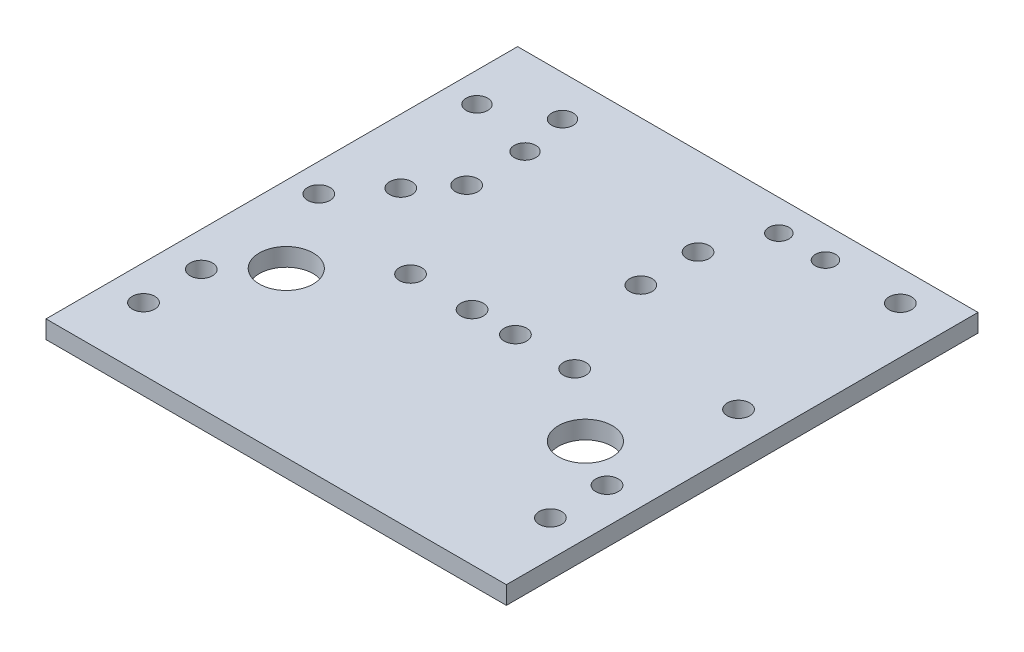
ISO-10303-21;
HEADER;
FILE_DESCRIPTION(('STEP AP214'),'2;1');
FILE_NAME('part.step','',(''),(''),'','','');
FILE_SCHEMA(('AUTOMOTIVE_DESIGN { 1 0 10303 214 1 1 1 1 }'));
ENDSEC;
DATA;
#1=APPLICATION_CONTEXT('core data for automotive mechanical design processes');
#2=APPLICATION_PROTOCOL_DEFINITION('international standard','automotive_design',2000,#1);
#3=PRODUCT_CONTEXT('',#1,'mechanical');
#4=PRODUCT('Part','Part','',(#3));
#5=PRODUCT_RELATED_PRODUCT_CATEGORY('part','',(#4));
#6=PRODUCT_DEFINITION_FORMATION('','',#4);
#7=PRODUCT_DEFINITION_CONTEXT('part definition',#1,'design');
#8=PRODUCT_DEFINITION('design','',#6,#7);
#9=PRODUCT_DEFINITION_SHAPE('','',#8);
#10=(LENGTH_UNIT() NAMED_UNIT(*) SI_UNIT(.MILLI.,.METRE.));
#11=(NAMED_UNIT(*) PLANE_ANGLE_UNIT() SI_UNIT($,.RADIAN.));
#12=(NAMED_UNIT(*) SI_UNIT($,.STERADIAN.) SOLID_ANGLE_UNIT());
#13=UNCERTAINTY_MEASURE_WITH_UNIT(LENGTH_MEASURE(1.E-05),#10,'distance_accuracy_value','');
#14=(GEOMETRIC_REPRESENTATION_CONTEXT(3) GLOBAL_UNCERTAINTY_ASSIGNED_CONTEXT((#13)) GLOBAL_UNIT_ASSIGNED_CONTEXT((#10,
#11,#12)) REPRESENTATION_CONTEXT('',''));
#15=CARTESIAN_POINT('',(0.,0.,0.));
#16=DIRECTION('',(0.,0.,1.));
#17=DIRECTION('',(1.,0.,0.));
#18=AXIS2_PLACEMENT_3D('',#15,#16,#17);
#19=CARTESIAN_POINT('',(10.25,0.8,10.5));
#20=DIRECTION('',(-1.,0.,0.));
#21=DIRECTION('',(0.,0.,1.));
#22=AXIS2_PLACEMENT_3D('',#19,#20,#21);
#23=PLANE('',#22);
#24=DIRECTION('',(0.,0.,-1.));
#25=VECTOR('',#24,1.);
#26=CARTESIAN_POINT('',(10.25,0.,10.5));
#27=LINE('',#26,#25);
#28=CARTESIAN_POINT('',(10.25,0.,10.5));
#29=VERTEX_POINT('',#28);
#30=CARTESIAN_POINT('',(10.25,0.,-10.5));
#31=VERTEX_POINT('',#30);
#32=EDGE_CURVE('E102',#29,#31,#27,.T.);
#33=ORIENTED_EDGE('',*,*,#32,.T.);
#34=DIRECTION('',(0.,-1.,0.));
#35=VECTOR('',#34,1.);
#36=CARTESIAN_POINT('',(10.25,0.8,-10.5));
#37=LINE('',#36,#35);
#38=CARTESIAN_POINT('',(10.25,0.8,-10.5));
#39=VERTEX_POINT('',#38);
#40=EDGE_CURVE('E11',#39,#31,#37,.T.);
#41=ORIENTED_EDGE('',*,*,#40,.F.);
#42=DIRECTION('',(0.,0.,-1.));
#43=VECTOR('',#42,1.);
#44=CARTESIAN_POINT('',(10.25,0.8,10.5));
#45=LINE('',#44,#43);
#46=CARTESIAN_POINT('',(10.25,0.8,10.5));
#47=VERTEX_POINT('',#46);
#48=EDGE_CURVE('E89',#47,#39,#45,.T.);
#49=ORIENTED_EDGE('',*,*,#48,.F.);
#50=DIRECTION('',(0.,-1.,0.));
#51=VECTOR('',#50,1.);
#52=CARTESIAN_POINT('',(10.25,0.8,10.5));
#53=LINE('',#52,#51);
#54=EDGE_CURVE('E98',#47,#29,#53,.T.);
#55=ORIENTED_EDGE('',*,*,#54,.T.);
#56=EDGE_LOOP('',(#33,#41,#49,#55));
#57=FACE_BOUND('',#56,.T.);
#58=ADVANCED_FACE('F36',(#57),#23,.F.);
#59=CARTESIAN_POINT('',(-10.25,0.8,-10.5));
#60=DIRECTION('',(0.,0.,1.));
#61=DIRECTION('',(1.,0.,0.));
#62=AXIS2_PLACEMENT_3D('',#59,#60,#61);
#63=PLANE('',#62);
#64=DIRECTION('',(-1.,0.,0.));
#65=VECTOR('',#64,1.);
#66=CARTESIAN_POINT('',(-10.25,0.,-10.5));
#67=LINE('',#66,#65);
#68=CARTESIAN_POINT('',(-10.25,0.,-10.5));
#69=VERTEX_POINT('',#68);
#70=EDGE_CURVE('E93',#31,#69,#67,.T.);
#71=ORIENTED_EDGE('',*,*,#70,.T.);
#72=DIRECTION('',(0.,-1.,0.));
#73=VECTOR('',#72,1.);
#74=CARTESIAN_POINT('',(-10.25,0.8,-10.5));
#75=LINE('',#74,#73);
#76=CARTESIAN_POINT('',(-10.25,0.8,-10.5));
#77=VERTEX_POINT('',#76);
#78=EDGE_CURVE('E45',#77,#69,#75,.T.);
#79=ORIENTED_EDGE('',*,*,#78,.F.);
#80=DIRECTION('',(-1.,0.,0.));
#81=VECTOR('',#80,1.);
#82=CARTESIAN_POINT('',(-10.25,0.8,-10.5));
#83=LINE('',#82,#81);
#84=EDGE_CURVE('E84',#39,#77,#83,.T.);
#85=ORIENTED_EDGE('',*,*,#84,.F.);
#86=ORIENTED_EDGE('',*,*,#40,.T.);
#87=EDGE_LOOP('',(#71,#79,#85,#86));
#88=FACE_BOUND('',#87,.T.);
#89=ADVANCED_FACE('F92',(#88),#63,.F.);
#90=CARTESIAN_POINT('',(-10.25,0.8,10.5));
#91=DIRECTION('',(1.,0.,0.));
#92=DIRECTION('',(0.,0.,-1.));
#93=AXIS2_PLACEMENT_3D('',#90,#91,#92);
#94=PLANE('',#93);
#95=DIRECTION('',(0.,0.,1.));
#96=VECTOR('',#95,1.);
#97=CARTESIAN_POINT('',(-10.25,0.,10.5));
#98=LINE('',#97,#96);
#99=CARTESIAN_POINT('',(-10.25,0.,10.5));
#100=VERTEX_POINT('',#99);
#101=EDGE_CURVE('E71',#69,#100,#98,.T.);
#102=ORIENTED_EDGE('',*,*,#101,.T.);
#103=DIRECTION('',(0.,-1.,0.));
#104=VECTOR('',#103,1.);
#105=CARTESIAN_POINT('',(-10.25,0.8,10.5));
#106=LINE('',#105,#104);
#107=CARTESIAN_POINT('',(-10.25,0.8,10.5));
#108=VERTEX_POINT('',#107);
#109=EDGE_CURVE('E94',#108,#100,#106,.T.);
#110=ORIENTED_EDGE('',*,*,#109,.F.);
#111=DIRECTION('',(0.,0.,1.));
#112=VECTOR('',#111,1.);
#113=CARTESIAN_POINT('',(-10.25,0.8,10.5));
#114=LINE('',#113,#112);
#115=EDGE_CURVE('E87',#77,#108,#114,.T.);
#116=ORIENTED_EDGE('',*,*,#115,.F.);
#117=ORIENTED_EDGE('',*,*,#78,.T.);
#118=EDGE_LOOP('',(#102,#110,#116,#117));
#119=FACE_BOUND('',#118,.T.);
#120=ADVANCED_FACE('F96',(#119),#94,.F.);
#121=CARTESIAN_POINT('',(-10.25,0.8,10.5));
#122=DIRECTION('',(0.,0.,-1.));
#123=DIRECTION('',(-1.,0.,0.));
#124=AXIS2_PLACEMENT_3D('',#121,#122,#123);
#125=PLANE('',#124);
#126=DIRECTION('',(1.,0.,0.));
#127=VECTOR('',#126,1.);
#128=CARTESIAN_POINT('',(-10.25,0.,10.5));
#129=LINE('',#128,#127);
#130=EDGE_CURVE('E77',#100,#29,#129,.T.);
#131=ORIENTED_EDGE('',*,*,#130,.T.);
#132=ORIENTED_EDGE('',*,*,#54,.F.);
#133=DIRECTION('',(1.,0.,0.));
#134=VECTOR('',#133,1.);
#135=CARTESIAN_POINT('',(-10.25,0.8,10.5));
#136=LINE('',#135,#134);
#137=EDGE_CURVE('E54',#108,#47,#136,.T.);
#138=ORIENTED_EDGE('',*,*,#137,.F.);
#139=ORIENTED_EDGE('',*,*,#109,.T.);
#140=EDGE_LOOP('',(#131,#132,#138,#139));
#141=FACE_BOUND('',#140,.T.);
#142=ADVANCED_FACE('F268',(#141),#125,.F.);
#143=CARTESIAN_POINT('',(10.25,0.8,-10.5));
#144=DIRECTION('',(0.,-1.,0.));
#145=DIRECTION('',(0.,0.,-1.));
#146=AXIS2_PLACEMENT_3D('',#143,#144,#145);
#147=PLANE('',#146);
#148=CARTESIAN_POINT('',(-7.39207812711201,0.8,-2.43981803095817));
#149=DIRECTION('',(0.,-1.,0.));
#150=DIRECTION('',(0.,0.,-1.));
#151=AXIS2_PLACEMENT_3D('',#148,#149,#150);
#152=CIRCLE('',#151,0.500000000000001);
#153=CARTESIAN_POINT('',(-7.39207812711201,0.8,-2.93981803095817));
#154=VERTEX_POINT('',#153);
#155=EDGE_CURVE('E192',#154,#154,#152,.T.);
#156=ORIENTED_EDGE('',*,*,#155,.T.);
#157=EDGE_LOOP('',(#156));
#158=FACE_BOUND('',#157,.T.);
#159=CARTESIAN_POINT('',(-6.03826285943662,0.8,-4.01767566516349));
#160=DIRECTION('',(0.,-1.,0.));
#161=DIRECTION('',(0.,0.,-1.));
#162=AXIS2_PLACEMENT_3D('',#159,#160,#161);
#163=CIRCLE('',#162,0.500000000000001);
#164=CARTESIAN_POINT('',(-6.03826285943662,0.8,-4.51767566516349));
#165=VERTEX_POINT('',#164);
#166=EDGE_CURVE('E189',#165,#165,#163,.T.);
#167=ORIENTED_EDGE('',*,*,#166,.T.);
#168=EDGE_LOOP('',(#167));
#169=FACE_BOUND('',#168,.T.);
#170=CARTESIAN_POINT('',(-8.92956931040423,0.8,-7.36837921363242));
#171=DIRECTION('',(0.,-1.,0.));
#172=DIRECTION('',(0.,0.,-1.));
#173=AXIS2_PLACEMENT_3D('',#170,#171,#172);
#174=CIRCLE('',#173,0.478821700842758);
#175=CARTESIAN_POINT('',(-8.92956931040423,0.8,-7.84720091447518));
#176=VERTEX_POINT('',#175);
#177=EDGE_CURVE('E186',#176,#176,#174,.T.);
#178=ORIENTED_EDGE('',*,*,#177,.T.);
#179=EDGE_LOOP('',(#178));
#180=FACE_BOUND('',#179,.T.);
#181=CARTESIAN_POINT('',(-6.03826285943662,0.8,-6.61903719253691));
#182=DIRECTION('',(0.,-1.,0.));
#183=DIRECTION('',(0.,0.,-1.));
#184=AXIS2_PLACEMENT_3D('',#181,#182,#183);
#185=CIRCLE('',#184,0.478821700842759);
#186=CARTESIAN_POINT('',(-6.03826285943662,0.8,-7.09785889337967));
#187=VERTEX_POINT('',#186);
#188=EDGE_CURVE('E182',#187,#187,#185,.T.);
#189=ORIENTED_EDGE('',*,*,#188,.T.);
#190=EDGE_LOOP('',(#189));
#191=FACE_BOUND('',#190,.T.);
#192=CARTESIAN_POINT('',(-6.45190600054324,0.8,-8.70056235245988));
#193=DIRECTION('',(0.,-1.,0.));
#194=DIRECTION('',(0.,0.,-1.));
#195=AXIS2_PLACEMENT_3D('',#192,#193,#194);
#196=CIRCLE('',#195,0.478821700842759);
#197=CARTESIAN_POINT('',(-6.45190600054324,0.8,-9.17938405330264));
#198=VERTEX_POINT('',#197);
#199=EDGE_CURVE('E178',#198,#198,#196,.T.);
#200=ORIENTED_EDGE('',*,*,#199,.T.);
#201=EDGE_LOOP('',(#200));
#202=FACE_BOUND('',#201,.T.);
#203=CARTESIAN_POINT('',(1.69141653802199,0.8,-4.04532466554236));
#204=DIRECTION('',(0.,-1.,0.));
#205=DIRECTION('',(0.,0.,-1.));
#206=AXIS2_PLACEMENT_3D('',#203,#204,#205);
#207=CIRCLE('',#206,0.5);
#208=CARTESIAN_POINT('',(1.69141653802199,0.8,-4.54532466554236));
#209=VERTEX_POINT('',#208);
#210=EDGE_CURVE('E174',#209,#209,#207,.T.);
#211=ORIENTED_EDGE('',*,*,#210,.T.);
#212=EDGE_LOOP('',(#211));
#213=FACE_BOUND('',#212,.T.);
#214=CARTESIAN_POINT('',(3.44608943323451,0.8,0.657838237632084));
#215=DIRECTION('',(0.,-1.,0.));
#216=DIRECTION('',(0.,0.,-1.));
#217=AXIS2_PLACEMENT_3D('',#214,#215,#216);
#218=CIRCLE('',#217,0.500000000000001);
#219=CARTESIAN_POINT('',(3.44608943323451,0.8,0.157838237632083));
#220=VERTEX_POINT('',#219);
#221=EDGE_CURVE('E170',#220,#220,#218,.T.);
#222=ORIENTED_EDGE('',*,*,#221,.T.);
#223=EDGE_LOOP('',(#222));
#224=FACE_BOUND('',#223,.T.);
#225=CARTESIAN_POINT('',(0.809655436640624,0.8,0.657838237632084));
#226=DIRECTION('',(0.,-1.,0.));
#227=DIRECTION('',(0.,0.,-1.));
#228=AXIS2_PLACEMENT_3D('',#225,#226,#227);
#229=CIRCLE('',#228,0.5);
#230=CARTESIAN_POINT('',(0.809655436640624,0.8,0.157838237632084));
#231=VERTEX_POINT('',#230);
#232=EDGE_CURVE('E166',#231,#231,#229,.T.);
#233=ORIENTED_EDGE('',*,*,#232,.T.);
#234=EDGE_LOOP('',(#233));
#235=FACE_BOUND('',#234,.T.);
#236=CARTESIAN_POINT('',(-1.1202831752451,0.8,0.657838237632084));
#237=DIRECTION('',(0.,-1.,0.));
#238=DIRECTION('',(0.,0.,-1.));
#239=AXIS2_PLACEMENT_3D('',#236,#237,#238);
#240=CIRCLE('',#239,0.5);
#241=CARTESIAN_POINT('',(-1.1202831752451,0.8,0.157838237632084));
#242=VERTEX_POINT('',#241);
#243=EDGE_CURVE('E162',#242,#242,#240,.T.);
#244=ORIENTED_EDGE('',*,*,#243,.T.);
#245=EDGE_LOOP('',(#244));
#246=FACE_BOUND('',#245,.T.);
#247=CARTESIAN_POINT('',(-3.86010674033287,0.8,0.657838237632084));
#248=DIRECTION('',(0.,-1.,0.));
#249=DIRECTION('',(0.,0.,-1.));
#250=AXIS2_PLACEMENT_3D('',#247,#248,#249);
#251=CIRCLE('',#250,0.5);
#252=CARTESIAN_POINT('',(-3.86010674033287,0.8,0.157838237632084));
#253=VERTEX_POINT('',#252);
#254=EDGE_CURVE('E158',#253,#253,#251,.T.);
#255=ORIENTED_EDGE('',*,*,#254,.T.);
#256=EDGE_LOOP('',(#255));
#257=FACE_BOUND('',#256,.T.);
#258=CARTESIAN_POINT('',(-8.99408321230006,0.8,-0.392498409159328));
#259=DIRECTION('',(0.,-1.,0.));
#260=DIRECTION('',(0.,0.,-1.));
#261=AXIS2_PLACEMENT_3D('',#258,#259,#260);
#262=CIRCLE('',#261,0.500000000000001);
#263=CARTESIAN_POINT('',(-8.99408321230006,0.8,-0.892498409159329));
#264=VERTEX_POINT('',#263);
#265=EDGE_CURVE('E154',#264,#264,#262,.T.);
#266=ORIENTED_EDGE('',*,*,#265,.T.);
#267=EDGE_LOOP('',(#266));
#268=FACE_BOUND('',#267,.T.);
#269=CARTESIAN_POINT('',(1.69141653802199,0.8,-6.59309673827541));
#270=DIRECTION('',(0.,-1.,0.));
#271=DIRECTION('',(0.,0.,-1.));
#272=AXIS2_PLACEMENT_3D('',#269,#270,#271);
#273=CIRCLE('',#272,0.5);
#274=CARTESIAN_POINT('',(1.69141653802199,0.8,-7.09309673827541));
#275=VERTEX_POINT('',#274);
#276=EDGE_CURVE('E150',#275,#275,#273,.T.);
#277=ORIENTED_EDGE('',*,*,#276,.T.);
#278=EDGE_LOOP('',(#277));
#279=FACE_BOUND('',#278,.T.);
#280=CARTESIAN_POINT('',(2.76166474969982,0.8,-9.12136932888456));
#281=DIRECTION('',(0.,-1.,0.));
#282=DIRECTION('',(0.,0.,-1.));
#283=AXIS2_PLACEMENT_3D('',#280,#281,#282);
#284=CIRCLE('',#283,0.45);
#285=CARTESIAN_POINT('',(2.76166474969982,0.8,-9.57136932888456));
#286=VERTEX_POINT('',#285);
#287=EDGE_CURVE('E146',#286,#286,#284,.T.);
#288=ORIENTED_EDGE('',*,*,#287,.T.);
#289=EDGE_LOOP('',(#288));
#290=FACE_BOUND('',#289,.T.);
#291=CARTESIAN_POINT('',(4.83657548134219,0.8,-9.12136932888456));
#292=DIRECTION('',(0.,-1.,0.));
#293=DIRECTION('',(0.,0.,-1.));
#294=AXIS2_PLACEMENT_3D('',#291,#292,#293);
#295=CIRCLE('',#294,0.450000000000001);
#296=CARTESIAN_POINT('',(4.83657548134219,0.8,-9.57136932888456));
#297=VERTEX_POINT('',#296);
#298=EDGE_CURVE('E142',#297,#297,#295,.T.);
#299=ORIENTED_EDGE('',*,*,#298,.T.);
#300=EDGE_LOOP('',(#299));
#301=FACE_BOUND('',#300,.T.);
#302=CARTESIAN_POINT('',(-8.70168734097871,0.8,7.70633577704424));
#303=DIRECTION('',(0.,-1.,0.));
#304=DIRECTION('',(0.,0.,-1.));
#305=AXIS2_PLACEMENT_3D('',#302,#303,#304);
#306=CIRCLE('',#305,0.500000000000001);
#307=CARTESIAN_POINT('',(-8.70168734097871,0.8,7.20633577704424));
#308=VERTEX_POINT('',#307);
#309=EDGE_CURVE('E138',#308,#308,#306,.T.);
#310=ORIENTED_EDGE('',*,*,#309,.T.);
#311=EDGE_LOOP('',(#310));
#312=FACE_BOUND('',#311,.T.);
#313=CARTESIAN_POINT('',(-8.70168734097871,0.8,5.13396842739723));
#314=DIRECTION('',(0.,-1.,0.));
#315=DIRECTION('',(0.,0.,-1.));
#316=AXIS2_PLACEMENT_3D('',#313,#314,#315);
#317=CIRCLE('',#316,0.500000000000001);
#318=CARTESIAN_POINT('',(-8.70168734097871,0.8,4.63396842739723));
#319=VERTEX_POINT('',#318);
#320=EDGE_CURVE('E134',#319,#319,#317,.T.);
#321=ORIENTED_EDGE('',*,*,#320,.T.);
#322=EDGE_LOOP('',(#321));
#323=FACE_BOUND('',#322,.T.);
#324=CARTESIAN_POINT('',(-6.84447604985823,0.8,3.20777438628292));
#325=DIRECTION('',(0.,-1.,0.));
#326=DIRECTION('',(0.,0.,-1.));
#327=AXIS2_PLACEMENT_3D('',#324,#325,#326);
#328=CIRCLE('',#327,1.2);
#329=CARTESIAN_POINT('',(-6.84447604985823,0.8,2.00777438628292));
#330=VERTEX_POINT('',#329);
#331=EDGE_CURVE('E130',#330,#330,#328,.T.);
#332=ORIENTED_EDGE('',*,*,#331,.T.);
#333=EDGE_LOOP('',(#332));
#334=FACE_BOUND('',#333,.T.);
#335=CARTESIAN_POINT('',(6.47563773305938,0.8,3.20777438628292));
#336=DIRECTION('',(0.,-1.,0.));
#337=DIRECTION('',(0.,0.,-1.));
#338=AXIS2_PLACEMENT_3D('',#335,#336,#337);
#339=CIRCLE('',#338,1.2);
#340=CARTESIAN_POINT('',(6.47563773305938,0.8,2.00777438628292));
#341=VERTEX_POINT('',#340);
#342=EDGE_CURVE('E126',#341,#341,#339,.T.);
#343=ORIENTED_EDGE('',*,*,#342,.T.);
#344=EDGE_LOOP('',(#343));
#345=FACE_BOUND('',#344,.T.);
#346=CARTESIAN_POINT('',(8.65627127832003,0.8,6.94657951870437));
#347=DIRECTION('',(0.,-1.,0.));
#348=DIRECTION('',(0.,0.,-1.));
#349=AXIS2_PLACEMENT_3D('',#346,#347,#348);
#350=CIRCLE('',#349,0.500000000000001);
#351=CARTESIAN_POINT('',(8.65627127832003,0.8,6.44657951870437));
#352=VERTEX_POINT('',#351);
#353=EDGE_CURVE('E122',#352,#352,#350,.T.);
#354=ORIENTED_EDGE('',*,*,#353,.T.);
#355=EDGE_LOOP('',(#354));
#356=FACE_BOUND('',#355,.T.);
#357=CARTESIAN_POINT('',(8.65627127832003,0.8,4.42551586051376));
#358=DIRECTION('',(0.,-1.,0.));
#359=DIRECTION('',(0.,0.,-1.));
#360=AXIS2_PLACEMENT_3D('',#357,#358,#359);
#361=CIRCLE('',#360,0.500000000000001);
#362=CARTESIAN_POINT('',(8.65627127832003,0.8,3.92551586051376));
#363=VERTEX_POINT('',#362);
#364=EDGE_CURVE('E118',#363,#363,#361,.T.);
#365=ORIENTED_EDGE('',*,*,#364,.T.);
#366=EDGE_LOOP('',(#365));
#367=FACE_BOUND('',#366,.T.);
#368=CARTESIAN_POINT('',(8.65627127832003,0.8,-1.43026765720544));
#369=DIRECTION('',(0.,-1.,0.));
#370=DIRECTION('',(0.,0.,-1.));
#371=AXIS2_PLACEMENT_3D('',#368,#369,#370);
#372=CIRCLE('',#371,0.500000000000001);
#373=CARTESIAN_POINT('',(8.65627127832003,0.8,-1.93026765720544));
#374=VERTEX_POINT('',#373);
#375=EDGE_CURVE('E114',#374,#374,#372,.T.);
#376=ORIENTED_EDGE('',*,*,#375,.T.);
#377=EDGE_LOOP('',(#376));
#378=FACE_BOUND('',#377,.T.);
#379=CARTESIAN_POINT('',(8.16958896463702,0.8,-9.12136932888456));
#380=DIRECTION('',(0.,-1.,0.));
#381=DIRECTION('',(0.,0.,-1.));
#382=AXIS2_PLACEMENT_3D('',#379,#380,#381);
#383=CIRCLE('',#382,0.500000000000001);
#384=CARTESIAN_POINT('',(8.16958896463702,0.8,-9.62136932888456));
#385=VERTEX_POINT('',#384);
#386=EDGE_CURVE('E105',#385,#385,#383,.T.);
#387=ORIENTED_EDGE('',*,*,#386,.T.);
#388=EDGE_LOOP('',(#387));
#389=FACE_BOUND('',#388,.T.);
#390=ORIENTED_EDGE('',*,*,#48,.T.);
#391=ORIENTED_EDGE('',*,*,#84,.T.);
#392=ORIENTED_EDGE('',*,*,#115,.T.);
#393=ORIENTED_EDGE('',*,*,#137,.T.);
#394=EDGE_LOOP('',(#390,#391,#392,#393));
#395=FACE_BOUND('',#394,.T.);
#396=ADVANCED_FACE('F85',(#158,#169,#180,#191,#202,#213,#224,#235,#246,#257,#268,#279,#290,#301,
#312,#323,#334,#345,#356,#367,#378,#389,#395),#147,.F.);
#397=CARTESIAN_POINT('',(10.25,0.,-10.5));
#398=DIRECTION('',(0.,-1.,0.));
#399=DIRECTION('',(0.,0.,-1.));
#400=AXIS2_PLACEMENT_3D('',#397,#398,#399);
#401=PLANE('',#400);
#402=CARTESIAN_POINT('',(-7.39207812711201,0.,-2.43981803095817));
#403=DIRECTION('',(0.,-1.,0.));
#404=DIRECTION('',(0.,0.,-1.));
#405=AXIS2_PLACEMENT_3D('',#402,#403,#404);
#406=CIRCLE('',#405,0.500000000000001);
#407=CARTESIAN_POINT('',(-7.39207812711201,0.,-2.93981803095817));
#408=VERTEX_POINT('',#407);
#409=EDGE_CURVE('E39',#408,#408,#406,.T.);
#410=ORIENTED_EDGE('',*,*,#409,.F.);
#411=EDGE_LOOP('',(#410));
#412=FACE_BOUND('',#411,.T.);
#413=CARTESIAN_POINT('',(-6.03826285943662,0.,-4.01767566516349));
#414=DIRECTION('',(0.,-1.,0.));
#415=DIRECTION('',(0.,0.,-1.));
#416=AXIS2_PLACEMENT_3D('',#413,#414,#415);
#417=CIRCLE('',#416,0.500000000000001);
#418=CARTESIAN_POINT('',(-6.03826285943662,0.,-4.51767566516349));
#419=VERTEX_POINT('',#418);
#420=EDGE_CURVE('E190',#419,#419,#417,.T.);
#421=ORIENTED_EDGE('',*,*,#420,.F.);
#422=EDGE_LOOP('',(#421));
#423=FACE_BOUND('',#422,.T.);
#424=CARTESIAN_POINT('',(-8.92956931040423,0.,-7.36837921363242));
#425=DIRECTION('',(0.,-1.,0.));
#426=DIRECTION('',(0.,0.,-1.));
#427=AXIS2_PLACEMENT_3D('',#424,#425,#426);
#428=CIRCLE('',#427,0.478821700842758);
#429=CARTESIAN_POINT('',(-8.92956931040423,0.,-7.84720091447518));
#430=VERTEX_POINT('',#429);
#431=EDGE_CURVE('E187',#430,#430,#428,.T.);
#432=ORIENTED_EDGE('',*,*,#431,.F.);
#433=EDGE_LOOP('',(#432));
#434=FACE_BOUND('',#433,.T.);
#435=CARTESIAN_POINT('',(-6.03826285943662,0.,-6.61903719253691));
#436=DIRECTION('',(0.,-1.,0.));
#437=DIRECTION('',(0.,0.,-1.));
#438=AXIS2_PLACEMENT_3D('',#435,#436,#437);
#439=CIRCLE('',#438,0.478821700842759);
#440=CARTESIAN_POINT('',(-6.03826285943662,0.,-7.09785889337967));
#441=VERTEX_POINT('',#440);
#442=EDGE_CURVE('E183',#441,#441,#439,.T.);
#443=ORIENTED_EDGE('',*,*,#442,.F.);
#444=EDGE_LOOP('',(#443));
#445=FACE_BOUND('',#444,.T.);
#446=CARTESIAN_POINT('',(-6.45190600054324,0.,-8.70056235245988));
#447=DIRECTION('',(0.,-1.,0.));
#448=DIRECTION('',(0.,0.,-1.));
#449=AXIS2_PLACEMENT_3D('',#446,#447,#448);
#450=CIRCLE('',#449,0.478821700842759);
#451=CARTESIAN_POINT('',(-6.45190600054324,0.,-9.17938405330264));
#452=VERTEX_POINT('',#451);
#453=EDGE_CURVE('E179',#452,#452,#450,.T.);
#454=ORIENTED_EDGE('',*,*,#453,.F.);
#455=EDGE_LOOP('',(#454));
#456=FACE_BOUND('',#455,.T.);
#457=CARTESIAN_POINT('',(1.69141653802199,0.,-4.04532466554236));
#458=DIRECTION('',(0.,-1.,0.));
#459=DIRECTION('',(0.,0.,-1.));
#460=AXIS2_PLACEMENT_3D('',#457,#458,#459);
#461=CIRCLE('',#460,0.5);
#462=CARTESIAN_POINT('',(1.69141653802199,0.,-4.54532466554236));
#463=VERTEX_POINT('',#462);
#464=EDGE_CURVE('E175',#463,#463,#461,.T.);
#465=ORIENTED_EDGE('',*,*,#464,.F.);
#466=EDGE_LOOP('',(#465));
#467=FACE_BOUND('',#466,.T.);
#468=CARTESIAN_POINT('',(3.44608943323451,0.,0.657838237632084));
#469=DIRECTION('',(0.,-1.,0.));
#470=DIRECTION('',(0.,0.,-1.));
#471=AXIS2_PLACEMENT_3D('',#468,#469,#470);
#472=CIRCLE('',#471,0.500000000000001);
#473=CARTESIAN_POINT('',(3.44608943323451,0.,0.157838237632083));
#474=VERTEX_POINT('',#473);
#475=EDGE_CURVE('E171',#474,#474,#472,.T.);
#476=ORIENTED_EDGE('',*,*,#475,.F.);
#477=EDGE_LOOP('',(#476));
#478=FACE_BOUND('',#477,.T.);
#479=CARTESIAN_POINT('',(0.809655436640624,0.,0.657838237632084));
#480=DIRECTION('',(0.,-1.,0.));
#481=DIRECTION('',(0.,0.,-1.));
#482=AXIS2_PLACEMENT_3D('',#479,#480,#481);
#483=CIRCLE('',#482,0.5);
#484=CARTESIAN_POINT('',(0.809655436640624,0.,0.157838237632084));
#485=VERTEX_POINT('',#484);
#486=EDGE_CURVE('E167',#485,#485,#483,.T.);
#487=ORIENTED_EDGE('',*,*,#486,.F.);
#488=EDGE_LOOP('',(#487));
#489=FACE_BOUND('',#488,.T.);
#490=CARTESIAN_POINT('',(-1.1202831752451,0.,0.657838237632084));
#491=DIRECTION('',(0.,-1.,0.));
#492=DIRECTION('',(0.,0.,-1.));
#493=AXIS2_PLACEMENT_3D('',#490,#491,#492);
#494=CIRCLE('',#493,0.5);
#495=CARTESIAN_POINT('',(-1.1202831752451,0.,0.157838237632084));
#496=VERTEX_POINT('',#495);
#497=EDGE_CURVE('E163',#496,#496,#494,.T.);
#498=ORIENTED_EDGE('',*,*,#497,.F.);
#499=EDGE_LOOP('',(#498));
#500=FACE_BOUND('',#499,.T.);
#501=CARTESIAN_POINT('',(-3.86010674033287,0.,0.657838237632084));
#502=DIRECTION('',(0.,-1.,0.));
#503=DIRECTION('',(0.,0.,-1.));
#504=AXIS2_PLACEMENT_3D('',#501,#502,#503);
#505=CIRCLE('',#504,0.5);
#506=CARTESIAN_POINT('',(-3.86010674033287,0.,0.157838237632084));
#507=VERTEX_POINT('',#506);
#508=EDGE_CURVE('E159',#507,#507,#505,.T.);
#509=ORIENTED_EDGE('',*,*,#508,.F.);
#510=EDGE_LOOP('',(#509));
#511=FACE_BOUND('',#510,.T.);
#512=CARTESIAN_POINT('',(-8.99408321230006,0.,-0.392498409159328));
#513=DIRECTION('',(0.,-1.,0.));
#514=DIRECTION('',(0.,0.,-1.));
#515=AXIS2_PLACEMENT_3D('',#512,#513,#514);
#516=CIRCLE('',#515,0.500000000000001);
#517=CARTESIAN_POINT('',(-8.99408321230006,0.,-0.892498409159329));
#518=VERTEX_POINT('',#517);
#519=EDGE_CURVE('E155',#518,#518,#516,.T.);
#520=ORIENTED_EDGE('',*,*,#519,.F.);
#521=EDGE_LOOP('',(#520));
#522=FACE_BOUND('',#521,.T.);
#523=CARTESIAN_POINT('',(1.69141653802199,0.,-6.59309673827541));
#524=DIRECTION('',(0.,-1.,0.));
#525=DIRECTION('',(0.,0.,-1.));
#526=AXIS2_PLACEMENT_3D('',#523,#524,#525);
#527=CIRCLE('',#526,0.5);
#528=CARTESIAN_POINT('',(1.69141653802199,0.,-7.09309673827541));
#529=VERTEX_POINT('',#528);
#530=EDGE_CURVE('E151',#529,#529,#527,.T.);
#531=ORIENTED_EDGE('',*,*,#530,.F.);
#532=EDGE_LOOP('',(#531));
#533=FACE_BOUND('',#532,.T.);
#534=CARTESIAN_POINT('',(2.76166474969982,0.,-9.12136932888456));
#535=DIRECTION('',(0.,-1.,0.));
#536=DIRECTION('',(0.,0.,-1.));
#537=AXIS2_PLACEMENT_3D('',#534,#535,#536);
#538=CIRCLE('',#537,0.45);
#539=CARTESIAN_POINT('',(2.76166474969982,0.,-9.57136932888456));
#540=VERTEX_POINT('',#539);
#541=EDGE_CURVE('E147',#540,#540,#538,.T.);
#542=ORIENTED_EDGE('',*,*,#541,.F.);
#543=EDGE_LOOP('',(#542));
#544=FACE_BOUND('',#543,.T.);
#545=CARTESIAN_POINT('',(4.83657548134219,0.,-9.12136932888456));
#546=DIRECTION('',(0.,-1.,0.));
#547=DIRECTION('',(0.,0.,-1.));
#548=AXIS2_PLACEMENT_3D('',#545,#546,#547);
#549=CIRCLE('',#548,0.450000000000001);
#550=CARTESIAN_POINT('',(4.83657548134219,0.,-9.57136932888456));
#551=VERTEX_POINT('',#550);
#552=EDGE_CURVE('E143',#551,#551,#549,.T.);
#553=ORIENTED_EDGE('',*,*,#552,.F.);
#554=EDGE_LOOP('',(#553));
#555=FACE_BOUND('',#554,.T.);
#556=CARTESIAN_POINT('',(-8.70168734097871,0.,7.70633577704424));
#557=DIRECTION('',(0.,-1.,0.));
#558=DIRECTION('',(0.,0.,-1.));
#559=AXIS2_PLACEMENT_3D('',#556,#557,#558);
#560=CIRCLE('',#559,0.500000000000001);
#561=CARTESIAN_POINT('',(-8.70168734097871,0.,7.20633577704424));
#562=VERTEX_POINT('',#561);
#563=EDGE_CURVE('E139',#562,#562,#560,.T.);
#564=ORIENTED_EDGE('',*,*,#563,.F.);
#565=EDGE_LOOP('',(#564));
#566=FACE_BOUND('',#565,.T.);
#567=CARTESIAN_POINT('',(-8.70168734097871,0.,5.13396842739723));
#568=DIRECTION('',(0.,-1.,0.));
#569=DIRECTION('',(0.,0.,-1.));
#570=AXIS2_PLACEMENT_3D('',#567,#568,#569);
#571=CIRCLE('',#570,0.500000000000001);
#572=CARTESIAN_POINT('',(-8.70168734097871,0.,4.63396842739723));
#573=VERTEX_POINT('',#572);
#574=EDGE_CURVE('E135',#573,#573,#571,.T.);
#575=ORIENTED_EDGE('',*,*,#574,.F.);
#576=EDGE_LOOP('',(#575));
#577=FACE_BOUND('',#576,.T.);
#578=CARTESIAN_POINT('',(-6.84447604985823,0.,3.20777438628292));
#579=DIRECTION('',(0.,-1.,0.));
#580=DIRECTION('',(0.,0.,-1.));
#581=AXIS2_PLACEMENT_3D('',#578,#579,#580);
#582=CIRCLE('',#581,1.2);
#583=CARTESIAN_POINT('',(-6.84447604985823,0.,2.00777438628292));
#584=VERTEX_POINT('',#583);
#585=EDGE_CURVE('E131',#584,#584,#582,.T.);
#586=ORIENTED_EDGE('',*,*,#585,.F.);
#587=EDGE_LOOP('',(#586));
#588=FACE_BOUND('',#587,.T.);
#589=CARTESIAN_POINT('',(6.47563773305938,0.,3.20777438628292));
#590=DIRECTION('',(0.,-1.,0.));
#591=DIRECTION('',(0.,0.,-1.));
#592=AXIS2_PLACEMENT_3D('',#589,#590,#591);
#593=CIRCLE('',#592,1.2);
#594=CARTESIAN_POINT('',(6.47563773305938,0.,2.00777438628292));
#595=VERTEX_POINT('',#594);
#596=EDGE_CURVE('E127',#595,#595,#593,.T.);
#597=ORIENTED_EDGE('',*,*,#596,.F.);
#598=EDGE_LOOP('',(#597));
#599=FACE_BOUND('',#598,.T.);
#600=CARTESIAN_POINT('',(8.65627127832003,0.,6.94657951870437));
#601=DIRECTION('',(0.,-1.,0.));
#602=DIRECTION('',(0.,0.,-1.));
#603=AXIS2_PLACEMENT_3D('',#600,#601,#602);
#604=CIRCLE('',#603,0.500000000000001);
#605=CARTESIAN_POINT('',(8.65627127832003,0.,6.44657951870437));
#606=VERTEX_POINT('',#605);
#607=EDGE_CURVE('E123',#606,#606,#604,.T.);
#608=ORIENTED_EDGE('',*,*,#607,.F.);
#609=EDGE_LOOP('',(#608));
#610=FACE_BOUND('',#609,.T.);
#611=CARTESIAN_POINT('',(8.65627127832003,0.,4.42551586051376));
#612=DIRECTION('',(0.,-1.,0.));
#613=DIRECTION('',(0.,0.,-1.));
#614=AXIS2_PLACEMENT_3D('',#611,#612,#613);
#615=CIRCLE('',#614,0.500000000000001);
#616=CARTESIAN_POINT('',(8.65627127832003,0.,3.92551586051376));
#617=VERTEX_POINT('',#616);
#618=EDGE_CURVE('E119',#617,#617,#615,.T.);
#619=ORIENTED_EDGE('',*,*,#618,.F.);
#620=EDGE_LOOP('',(#619));
#621=FACE_BOUND('',#620,.T.);
#622=CARTESIAN_POINT('',(8.65627127832003,0.,-1.43026765720544));
#623=DIRECTION('',(0.,-1.,0.));
#624=DIRECTION('',(0.,0.,-1.));
#625=AXIS2_PLACEMENT_3D('',#622,#623,#624);
#626=CIRCLE('',#625,0.500000000000001);
#627=CARTESIAN_POINT('',(8.65627127832003,0.,-1.93026765720544));
#628=VERTEX_POINT('',#627);
#629=EDGE_CURVE('E115',#628,#628,#626,.T.);
#630=ORIENTED_EDGE('',*,*,#629,.F.);
#631=EDGE_LOOP('',(#630));
#632=FACE_BOUND('',#631,.T.);
#633=CARTESIAN_POINT('',(8.16958896463702,0.,-9.12136932888456));
#634=DIRECTION('',(0.,-1.,0.));
#635=DIRECTION('',(0.,0.,-1.));
#636=AXIS2_PLACEMENT_3D('',#633,#634,#635);
#637=CIRCLE('',#636,0.500000000000001);
#638=CARTESIAN_POINT('',(8.16958896463702,0.,-9.62136932888456));
#639=VERTEX_POINT('',#638);
#640=EDGE_CURVE('E111',#639,#639,#637,.T.);
#641=ORIENTED_EDGE('',*,*,#640,.F.);
#642=EDGE_LOOP('',(#641));
#643=FACE_BOUND('',#642,.T.);
#644=ORIENTED_EDGE('',*,*,#32,.F.);
#645=ORIENTED_EDGE('',*,*,#130,.F.);
#646=ORIENTED_EDGE('',*,*,#101,.F.);
#647=ORIENTED_EDGE('',*,*,#70,.F.);
#648=EDGE_LOOP('',(#644,#645,#646,#647));
#649=FACE_BOUND('',#648,.T.);
#650=ADVANCED_FACE('F248',(#412,#423,#434,#445,#456,#467,#478,#489,#500,#511,#522,#533,#544,
#555,#566,#577,#588,#599,#610,#621,#632,#643,#649),#401,.T.);
#651=CARTESIAN_POINT('',(8.16958896463702,-4.2,-9.12136932888456));
#652=DIRECTION('',(0.,1.,0.));
#653=DIRECTION('',(0.,0.,1.));
#654=AXIS2_PLACEMENT_3D('',#651,#652,#653);
#655=CYLINDRICAL_SURFACE('',#654,0.500000000000001);
#656=ORIENTED_EDGE('',*,*,#640,.T.);
#657=EDGE_LOOP('',(#656));
#658=FACE_BOUND('',#657,.T.);
#659=ORIENTED_EDGE('',*,*,#386,.F.);
#660=EDGE_LOOP('',(#659));
#661=FACE_BOUND('',#660,.T.);
#662=ADVANCED_FACE('F245',(#658,#661),#655,.F.);
#663=CARTESIAN_POINT('',(8.65627127832003,-4.2,-1.43026765720544));
#664=DIRECTION('',(0.,1.,0.));
#665=DIRECTION('',(0.,0.,1.));
#666=AXIS2_PLACEMENT_3D('',#663,#664,#665);
#667=CYLINDRICAL_SURFACE('',#666,0.500000000000001);
#668=ORIENTED_EDGE('',*,*,#629,.T.);
#669=EDGE_LOOP('',(#668));
#670=FACE_BOUND('',#669,.T.);
#671=ORIENTED_EDGE('',*,*,#375,.F.);
#672=EDGE_LOOP('',(#671));
#673=FACE_BOUND('',#672,.T.);
#674=ADVANCED_FACE('F247',(#670,#673),#667,.F.);
#675=CARTESIAN_POINT('',(8.65627127832003,-4.2,4.42551586051376));
#676=DIRECTION('',(0.,1.,0.));
#677=DIRECTION('',(0.,0.,1.));
#678=AXIS2_PLACEMENT_3D('',#675,#676,#677);
#679=CYLINDRICAL_SURFACE('',#678,0.500000000000001);
#680=ORIENTED_EDGE('',*,*,#618,.T.);
#681=EDGE_LOOP('',(#680));
#682=FACE_BOUND('',#681,.T.);
#683=ORIENTED_EDGE('',*,*,#364,.F.);
#684=EDGE_LOOP('',(#683));
#685=FACE_BOUND('',#684,.T.);
#686=ADVANCED_FACE('F255',(#682,#685),#679,.F.);
#687=CARTESIAN_POINT('',(8.65627127832003,-4.2,6.94657951870437));
#688=DIRECTION('',(0.,1.,0.));
#689=DIRECTION('',(0.,0.,1.));
#690=AXIS2_PLACEMENT_3D('',#687,#688,#689);
#691=CYLINDRICAL_SURFACE('',#690,0.500000000000001);
#692=ORIENTED_EDGE('',*,*,#607,.T.);
#693=EDGE_LOOP('',(#692));
#694=FACE_BOUND('',#693,.T.);
#695=ORIENTED_EDGE('',*,*,#353,.F.);
#696=EDGE_LOOP('',(#695));
#697=FACE_BOUND('',#696,.T.);
#698=ADVANCED_FACE('F323',(#694,#697),#691,.F.);
#699=CARTESIAN_POINT('',(6.47563773305938,-4.2,3.20777438628292));
#700=DIRECTION('',(0.,1.,0.));
#701=DIRECTION('',(0.,0.,1.));
#702=AXIS2_PLACEMENT_3D('',#699,#700,#701);
#703=CYLINDRICAL_SURFACE('',#702,1.2);
#704=ORIENTED_EDGE('',*,*,#596,.T.);
#705=EDGE_LOOP('',(#704));
#706=FACE_BOUND('',#705,.T.);
#707=ORIENTED_EDGE('',*,*,#342,.F.);
#708=EDGE_LOOP('',(#707));
#709=FACE_BOUND('',#708,.T.);
#710=ADVANCED_FACE('F332',(#706,#709),#703,.F.);
#711=CARTESIAN_POINT('',(-6.84447604985823,-4.2,3.20777438628292));
#712=DIRECTION('',(0.,1.,0.));
#713=DIRECTION('',(0.,0.,1.));
#714=AXIS2_PLACEMENT_3D('',#711,#712,#713);
#715=CYLINDRICAL_SURFACE('',#714,1.2);
#716=ORIENTED_EDGE('',*,*,#585,.T.);
#717=EDGE_LOOP('',(#716));
#718=FACE_BOUND('',#717,.T.);
#719=ORIENTED_EDGE('',*,*,#331,.F.);
#720=EDGE_LOOP('',(#719));
#721=FACE_BOUND('',#720,.T.);
#722=ADVANCED_FACE('F341',(#718,#721),#715,.F.);
#723=CARTESIAN_POINT('',(-8.70168734097871,-4.2,5.13396842739723));
#724=DIRECTION('',(0.,1.,0.));
#725=DIRECTION('',(0.,0.,1.));
#726=AXIS2_PLACEMENT_3D('',#723,#724,#725);
#727=CYLINDRICAL_SURFACE('',#726,0.500000000000001);
#728=ORIENTED_EDGE('',*,*,#574,.T.);
#729=EDGE_LOOP('',(#728));
#730=FACE_BOUND('',#729,.T.);
#731=ORIENTED_EDGE('',*,*,#320,.F.);
#732=EDGE_LOOP('',(#731));
#733=FACE_BOUND('',#732,.T.);
#734=ADVANCED_FACE('F350',(#730,#733),#727,.F.);
#735=CARTESIAN_POINT('',(-8.70168734097871,-4.2,7.70633577704424));
#736=DIRECTION('',(0.,1.,0.));
#737=DIRECTION('',(0.,0.,1.));
#738=AXIS2_PLACEMENT_3D('',#735,#736,#737);
#739=CYLINDRICAL_SURFACE('',#738,0.500000000000001);
#740=ORIENTED_EDGE('',*,*,#563,.T.);
#741=EDGE_LOOP('',(#740));
#742=FACE_BOUND('',#741,.T.);
#743=ORIENTED_EDGE('',*,*,#309,.F.);
#744=EDGE_LOOP('',(#743));
#745=FACE_BOUND('',#744,.T.);
#746=ADVANCED_FACE('F359',(#742,#745),#739,.F.);
#747=CARTESIAN_POINT('',(4.83657548134219,-4.2,-9.12136932888456));
#748=DIRECTION('',(0.,1.,0.));
#749=DIRECTION('',(0.,0.,1.));
#750=AXIS2_PLACEMENT_3D('',#747,#748,#749);
#751=CYLINDRICAL_SURFACE('',#750,0.450000000000001);
#752=ORIENTED_EDGE('',*,*,#552,.T.);
#753=EDGE_LOOP('',(#752));
#754=FACE_BOUND('',#753,.T.);
#755=ORIENTED_EDGE('',*,*,#298,.F.);
#756=EDGE_LOOP('',(#755));
#757=FACE_BOUND('',#756,.T.);
#758=ADVANCED_FACE('F368',(#754,#757),#751,.F.);
#759=CARTESIAN_POINT('',(2.76166474969982,-4.2,-9.12136932888456));
#760=DIRECTION('',(0.,1.,0.));
#761=DIRECTION('',(0.,0.,1.));
#762=AXIS2_PLACEMENT_3D('',#759,#760,#761);
#763=CYLINDRICAL_SURFACE('',#762,0.45);
#764=ORIENTED_EDGE('',*,*,#541,.T.);
#765=EDGE_LOOP('',(#764));
#766=FACE_BOUND('',#765,.T.);
#767=ORIENTED_EDGE('',*,*,#287,.F.);
#768=EDGE_LOOP('',(#767));
#769=FACE_BOUND('',#768,.T.);
#770=ADVANCED_FACE('F377',(#766,#769),#763,.F.);
#771=CARTESIAN_POINT('',(1.69141653802199,-4.2,-6.59309673827541));
#772=DIRECTION('',(0.,1.,0.));
#773=DIRECTION('',(0.,0.,1.));
#774=AXIS2_PLACEMENT_3D('',#771,#772,#773);
#775=CYLINDRICAL_SURFACE('',#774,0.5);
#776=ORIENTED_EDGE('',*,*,#530,.T.);
#777=EDGE_LOOP('',(#776));
#778=FACE_BOUND('',#777,.T.);
#779=ORIENTED_EDGE('',*,*,#276,.F.);
#780=EDGE_LOOP('',(#779));
#781=FACE_BOUND('',#780,.T.);
#782=ADVANCED_FACE('F386',(#778,#781),#775,.F.);
#783=CARTESIAN_POINT('',(-8.99408321230006,-4.2,-0.392498409159328));
#784=DIRECTION('',(0.,1.,0.));
#785=DIRECTION('',(0.,0.,1.));
#786=AXIS2_PLACEMENT_3D('',#783,#784,#785);
#787=CYLINDRICAL_SURFACE('',#786,0.500000000000001);
#788=ORIENTED_EDGE('',*,*,#519,.T.);
#789=EDGE_LOOP('',(#788));
#790=FACE_BOUND('',#789,.T.);
#791=ORIENTED_EDGE('',*,*,#265,.F.);
#792=EDGE_LOOP('',(#791));
#793=FACE_BOUND('',#792,.T.);
#794=ADVANCED_FACE('F395',(#790,#793),#787,.F.);
#795=CARTESIAN_POINT('',(-3.86010674033287,-4.2,0.657838237632084));
#796=DIRECTION('',(0.,1.,0.));
#797=DIRECTION('',(0.,0.,1.));
#798=AXIS2_PLACEMENT_3D('',#795,#796,#797);
#799=CYLINDRICAL_SURFACE('',#798,0.5);
#800=ORIENTED_EDGE('',*,*,#508,.T.);
#801=EDGE_LOOP('',(#800));
#802=FACE_BOUND('',#801,.T.);
#803=ORIENTED_EDGE('',*,*,#254,.F.);
#804=EDGE_LOOP('',(#803));
#805=FACE_BOUND('',#804,.T.);
#806=ADVANCED_FACE('F404',(#802,#805),#799,.F.);
#807=CARTESIAN_POINT('',(-1.1202831752451,-4.2,0.657838237632084));
#808=DIRECTION('',(0.,1.,0.));
#809=DIRECTION('',(0.,0.,1.));
#810=AXIS2_PLACEMENT_3D('',#807,#808,#809);
#811=CYLINDRICAL_SURFACE('',#810,0.5);
#812=ORIENTED_EDGE('',*,*,#497,.T.);
#813=EDGE_LOOP('',(#812));
#814=FACE_BOUND('',#813,.T.);
#815=ORIENTED_EDGE('',*,*,#243,.F.);
#816=EDGE_LOOP('',(#815));
#817=FACE_BOUND('',#816,.T.);
#818=ADVANCED_FACE('F413',(#814,#817),#811,.F.);
#819=CARTESIAN_POINT('',(0.809655436640624,-4.2,0.657838237632084));
#820=DIRECTION('',(0.,1.,0.));
#821=DIRECTION('',(0.,0.,1.));
#822=AXIS2_PLACEMENT_3D('',#819,#820,#821);
#823=CYLINDRICAL_SURFACE('',#822,0.5);
#824=ORIENTED_EDGE('',*,*,#486,.T.);
#825=EDGE_LOOP('',(#824));
#826=FACE_BOUND('',#825,.T.);
#827=ORIENTED_EDGE('',*,*,#232,.F.);
#828=EDGE_LOOP('',(#827));
#829=FACE_BOUND('',#828,.T.);
#830=ADVANCED_FACE('F422',(#826,#829),#823,.F.);
#831=CARTESIAN_POINT('',(3.44608943323451,-4.2,0.657838237632084));
#832=DIRECTION('',(0.,1.,0.));
#833=DIRECTION('',(0.,0.,1.));
#834=AXIS2_PLACEMENT_3D('',#831,#832,#833);
#835=CYLINDRICAL_SURFACE('',#834,0.500000000000001);
#836=ORIENTED_EDGE('',*,*,#475,.T.);
#837=EDGE_LOOP('',(#836));
#838=FACE_BOUND('',#837,.T.);
#839=ORIENTED_EDGE('',*,*,#221,.F.);
#840=EDGE_LOOP('',(#839));
#841=FACE_BOUND('',#840,.T.);
#842=ADVANCED_FACE('F431',(#838,#841),#835,.F.);
#843=CARTESIAN_POINT('',(1.69141653802199,-4.2,-4.04532466554236));
#844=DIRECTION('',(0.,1.,0.));
#845=DIRECTION('',(0.,0.,1.));
#846=AXIS2_PLACEMENT_3D('',#843,#844,#845);
#847=CYLINDRICAL_SURFACE('',#846,0.5);
#848=ORIENTED_EDGE('',*,*,#464,.T.);
#849=EDGE_LOOP('',(#848));
#850=FACE_BOUND('',#849,.T.);
#851=ORIENTED_EDGE('',*,*,#210,.F.);
#852=EDGE_LOOP('',(#851));
#853=FACE_BOUND('',#852,.T.);
#854=ADVANCED_FACE('F440',(#850,#853),#847,.F.);
#855=CARTESIAN_POINT('',(-6.45190600054324,-4.2,-8.70056235245988));
#856=DIRECTION('',(0.,1.,0.));
#857=DIRECTION('',(0.,0.,1.));
#858=AXIS2_PLACEMENT_3D('',#855,#856,#857);
#859=CYLINDRICAL_SURFACE('',#858,0.478821700842759);
#860=ORIENTED_EDGE('',*,*,#453,.T.);
#861=EDGE_LOOP('',(#860));
#862=FACE_BOUND('',#861,.T.);
#863=ORIENTED_EDGE('',*,*,#199,.F.);
#864=EDGE_LOOP('',(#863));
#865=FACE_BOUND('',#864,.T.);
#866=ADVANCED_FACE('F449',(#862,#865),#859,.F.);
#867=CARTESIAN_POINT('',(-6.03826285943662,-4.2,-6.61903719253691));
#868=DIRECTION('',(0.,1.,0.));
#869=DIRECTION('',(0.,0.,1.));
#870=AXIS2_PLACEMENT_3D('',#867,#868,#869);
#871=CYLINDRICAL_SURFACE('',#870,0.478821700842759);
#872=ORIENTED_EDGE('',*,*,#442,.T.);
#873=EDGE_LOOP('',(#872));
#874=FACE_BOUND('',#873,.T.);
#875=ORIENTED_EDGE('',*,*,#188,.F.);
#876=EDGE_LOOP('',(#875));
#877=FACE_BOUND('',#876,.T.);
#878=ADVANCED_FACE('F458',(#874,#877),#871,.F.);
#879=CARTESIAN_POINT('',(-8.92956931040423,-4.2,-7.36837921363242));
#880=DIRECTION('',(0.,1.,0.));
#881=DIRECTION('',(0.,0.,1.));
#882=AXIS2_PLACEMENT_3D('',#879,#880,#881);
#883=CYLINDRICAL_SURFACE('',#882,0.478821700842758);
#884=ORIENTED_EDGE('',*,*,#431,.T.);
#885=EDGE_LOOP('',(#884));
#886=FACE_BOUND('',#885,.T.);
#887=ORIENTED_EDGE('',*,*,#177,.F.);
#888=EDGE_LOOP('',(#887));
#889=FACE_BOUND('',#888,.T.);
#890=ADVANCED_FACE('F467',(#886,#889),#883,.F.);
#891=CARTESIAN_POINT('',(-6.03826285943662,-4.2,-4.01767566516349));
#892=DIRECTION('',(0.,1.,0.));
#893=DIRECTION('',(0.,0.,1.));
#894=AXIS2_PLACEMENT_3D('',#891,#892,#893);
#895=CYLINDRICAL_SURFACE('',#894,0.500000000000001);
#896=ORIENTED_EDGE('',*,*,#420,.T.);
#897=EDGE_LOOP('',(#896));
#898=FACE_BOUND('',#897,.T.);
#899=ORIENTED_EDGE('',*,*,#166,.F.);
#900=EDGE_LOOP('',(#899));
#901=FACE_BOUND('',#900,.T.);
#902=ADVANCED_FACE('F476',(#898,#901),#895,.F.);
#903=CARTESIAN_POINT('',(-7.39207812711201,-4.2,-2.43981803095817));
#904=DIRECTION('',(0.,1.,0.));
#905=DIRECTION('',(0.,0.,1.));
#906=AXIS2_PLACEMENT_3D('',#903,#904,#905);
#907=CYLINDRICAL_SURFACE('',#906,0.500000000000001);
#908=ORIENTED_EDGE('',*,*,#409,.T.);
#909=EDGE_LOOP('',(#908));
#910=FACE_BOUND('',#909,.T.);
#911=ORIENTED_EDGE('',*,*,#155,.F.);
#912=EDGE_LOOP('',(#911));
#913=FACE_BOUND('',#912,.T.);
#914=ADVANCED_FACE('F485',(#910,#913),#907,.F.);
#915=CLOSED_SHELL('',(#58,#89,#120,#142,#396,#650,#662,#674,#686,#698,#710,#722,#734,#746,#758,
#770,#782,#794,#806,#818,#830,#842,#854,#866,#878,#890,#902,#914));
#916=MANIFOLD_SOLID_BREP('B2',#915);
#917=ADVANCED_BREP_SHAPE_REPRESENTATION('',(#18,#916),#14);
#918=SHAPE_DEFINITION_REPRESENTATION(#9,#917);
ENDSEC;
END-ISO-10303-21;
